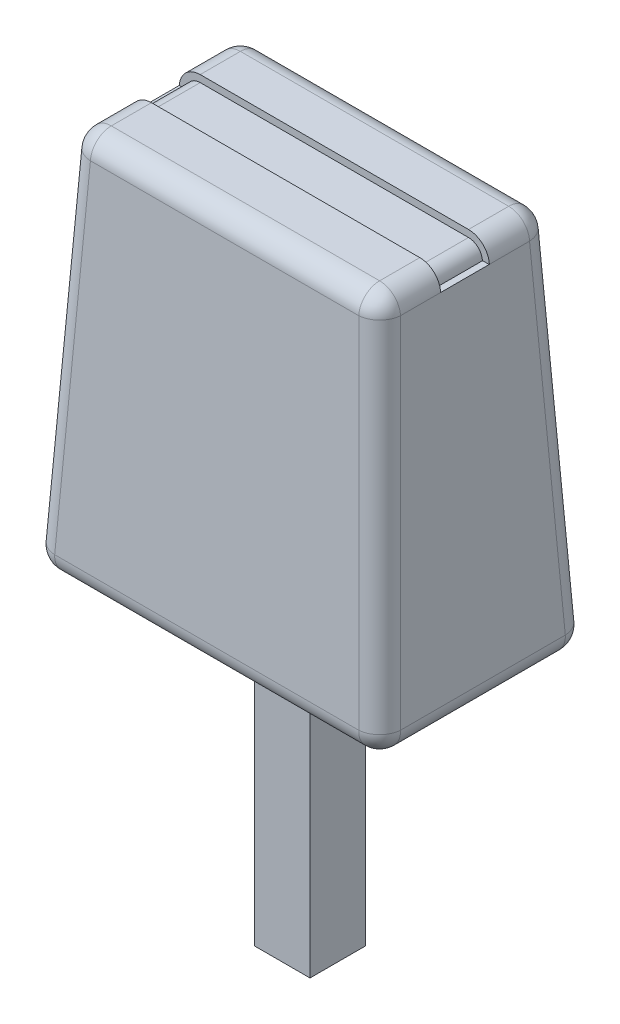
ISO-10303-21;
HEADER;
FILE_DESCRIPTION(('STEP AP214'),'2;1');
FILE_NAME('part.step','',(''),(''),'','','');
FILE_SCHEMA(('AUTOMOTIVE_DESIGN { 1 0 10303 214 1 1 1 1 }'));
ENDSEC;
DATA;
#1=APPLICATION_CONTEXT('core data for automotive mechanical design processes');
#2=APPLICATION_PROTOCOL_DEFINITION('international standard','automotive_design',2000,#1);
#3=PRODUCT_CONTEXT('',#1,'mechanical');
#4=PRODUCT('Part','Part','',(#3));
#5=PRODUCT_RELATED_PRODUCT_CATEGORY('part','',(#4));
#6=PRODUCT_DEFINITION_FORMATION('','',#4);
#7=PRODUCT_DEFINITION_CONTEXT('part definition',#1,'design');
#8=PRODUCT_DEFINITION('design','',#6,#7);
#9=PRODUCT_DEFINITION_SHAPE('','',#8);
#10=(LENGTH_UNIT() NAMED_UNIT(*) SI_UNIT(.MILLI.,.METRE.));
#11=(NAMED_UNIT(*) PLANE_ANGLE_UNIT() SI_UNIT($,.RADIAN.));
#12=(NAMED_UNIT(*) SI_UNIT($,.STERADIAN.) SOLID_ANGLE_UNIT());
#13=UNCERTAINTY_MEASURE_WITH_UNIT(LENGTH_MEASURE(1.E-05),#10,'distance_accuracy_value','');
#14=(GEOMETRIC_REPRESENTATION_CONTEXT(3) GLOBAL_UNCERTAINTY_ASSIGNED_CONTEXT((#13)) GLOBAL_UNIT_ASSIGNED_CONTEXT((#10,
#11,#12)) REPRESENTATION_CONTEXT('',''));
#15=CARTESIAN_POINT('',(0.,0.,0.));
#16=DIRECTION('',(0.,0.,1.));
#17=DIRECTION('',(1.,0.,0.));
#18=AXIS2_PLACEMENT_3D('',#15,#16,#17);
#19=CARTESIAN_POINT('',(0.,27.5,0.));
#20=DIRECTION('',(0.,-1.,0.));
#21=DIRECTION('',(0.,0.,-1.));
#22=AXIS2_PLACEMENT_3D('',#19,#20,#21);
#23=PLANE('',#22);
#24=DIRECTION('',(-1.,0.,0.));
#25=VECTOR('',#24,1.);
#26=CARTESIAN_POINT('',(-9.63533921964405,27.5,-1.75));
#27=LINE('',#26,#25);
#28=CARTESIAN_POINT('',(9.63533921964404,27.5,-1.75));
#29=VERTEX_POINT('',#28);
#30=CARTESIAN_POINT('',(-9.63533921964405,27.5,-1.75));
#31=VERTEX_POINT('',#30);
#32=EDGE_CURVE('E215',#29,#31,#27,.T.);
#33=ORIENTED_EDGE('',*,*,#32,.F.);
#34=DIRECTION('',(0.,0.,1.));
#35=VECTOR('',#34,1.);
#36=CARTESIAN_POINT('',(9.63533921964404,27.5,0.));
#37=LINE('',#36,#35);
#38=CARTESIAN_POINT('',(9.63533921964404,27.5,-4.63533921964404));
#39=VERTEX_POINT('',#38);
#40=EDGE_CURVE('E228',#29,#39,#37,.F.);
#41=ORIENTED_EDGE('',*,*,#40,.T.);
#42=DIRECTION('',(1.,0.,0.));
#43=VECTOR('',#42,1.);
#44=CARTESIAN_POINT('',(0.,27.5,-4.63533921964404));
#45=LINE('',#44,#43);
#46=CARTESIAN_POINT('',(-9.63533921964405,27.5,-4.63533921964404));
#47=VERTEX_POINT('',#46);
#48=EDGE_CURVE('E241',#39,#47,#45,.F.);
#49=ORIENTED_EDGE('',*,*,#48,.T.);
#50=DIRECTION('',(0.,0.,-1.));
#51=VECTOR('',#50,1.);
#52=CARTESIAN_POINT('',(-9.63533921964405,27.5,0.));
#53=LINE('',#52,#51);
#54=EDGE_CURVE('E56',#47,#31,#53,.F.);
#55=ORIENTED_EDGE('',*,*,#54,.T.);
#56=EDGE_LOOP('',(#33,#41,#49,#55));
#57=FACE_BOUND('',#56,.T.);
#58=ADVANCED_FACE('F47',(#57),#23,.F.);
#59=CARTESIAN_POINT('',(-9.63533921964405,26.,0.));
#60=DIRECTION('',(0.,0.,-1.));
#61=DIRECTION('',(-1.,0.,0.));
#62=AXIS2_PLACEMENT_3D('',#59,#60,#61);
#63=CYLINDRICAL_SURFACE('',#62,1.5);
#64=DIRECTION('',(0.,0.,1.));
#65=VECTOR('',#64,1.);
#66=CARTESIAN_POINT('',(-11.1332835217759,26.0785039343644,7.5));
#67=LINE('',#66,#65);
#68=CARTESIAN_POINT('',(-11.1332835217759,26.0785039343644,-1.75));
#69=VERTEX_POINT('',#68);
#70=CARTESIAN_POINT('',(-11.1332835217759,26.0785039343644,-4.63533921964404));
#71=VERTEX_POINT('',#70);
#72=EDGE_CURVE('E363',#69,#71,#67,.F.);
#73=ORIENTED_EDGE('',*,*,#72,.F.);
#74=CARTESIAN_POINT('',(-9.63533921964405,26.,-1.75));
#75=DIRECTION('',(0.,0.,1.));
#76=DIRECTION('',(1.,0.,0.));
#77=AXIS2_PLACEMENT_3D('',#74,#75,#76);
#78=CIRCLE('',#77,1.5);
#79=EDGE_CURVE('E231',#31,#69,#78,.T.);
#80=ORIENTED_EDGE('',*,*,#79,.F.);
#81=ORIENTED_EDGE('',*,*,#54,.F.);
#82=CARTESIAN_POINT('',(-9.63533921964405,26.,-4.63533921964404));
#83=DIRECTION('',(0.,0.,-1.));
#84=DIRECTION('',(-1.,0.,0.));
#85=AXIS2_PLACEMENT_3D('',#82,#83,#84);
#86=CIRCLE('',#85,1.5);
#87=EDGE_CURVE('E306',#47,#71,#86,.F.);
#88=ORIENTED_EDGE('',*,*,#87,.T.);
#89=EDGE_LOOP('',(#73,#80,#81,#88));
#90=FACE_BOUND('',#89,.T.);
#91=ADVANCED_FACE('F497',(#90),#63,.T.);
#92=CARTESIAN_POINT('',(9.63533921964404,26.,0.));
#93=DIRECTION('',(0.,0.,1.));
#94=DIRECTION('',(1.,0.,0.));
#95=AXIS2_PLACEMENT_3D('',#92,#93,#94);
#96=CYLINDRICAL_SURFACE('',#95,1.5);
#97=ORIENTED_EDGE('',*,*,#40,.F.);
#98=CARTESIAN_POINT('',(9.63533921964404,26.,-1.75));
#99=DIRECTION('',(0.,0.,1.));
#100=DIRECTION('',(1.,0.,0.));
#101=AXIS2_PLACEMENT_3D('',#98,#99,#100);
#102=CIRCLE('',#101,1.5);
#103=CARTESIAN_POINT('',(11.1332835217759,26.0785039343644,-1.75));
#104=VERTEX_POINT('',#103);
#105=EDGE_CURVE('E211',#104,#29,#102,.T.);
#106=ORIENTED_EDGE('',*,*,#105,.F.);
#107=DIRECTION('',(0.,0.,-1.));
#108=VECTOR('',#107,1.);
#109=CARTESIAN_POINT('',(11.1332835217759,26.0785039343644,7.5));
#110=LINE('',#109,#108);
#111=CARTESIAN_POINT('',(11.1332835217759,26.0785039343644,-4.63533921964404));
#112=VERTEX_POINT('',#111);
#113=EDGE_CURVE('E320',#112,#104,#110,.F.);
#114=ORIENTED_EDGE('',*,*,#113,.F.);
#115=CARTESIAN_POINT('',(9.63533921964404,26.,-4.63533921964404));
#116=DIRECTION('',(0.,0.,-1.));
#117=DIRECTION('',(-1.,0.,0.));
#118=AXIS2_PLACEMENT_3D('',#115,#116,#117);
#119=CIRCLE('',#118,1.5);
#120=EDGE_CURVE('E236',#112,#39,#119,.F.);
#121=ORIENTED_EDGE('',*,*,#120,.T.);
#122=EDGE_LOOP('',(#97,#106,#114,#121));
#123=FACE_BOUND('',#122,.T.);
#124=ADVANCED_FACE('F234',(#123),#96,.T.);
#125=CARTESIAN_POINT('',(0.,0.,0.));
#126=DIRECTION('',(0.,-1.,0.));
#127=DIRECTION('',(0.,0.,-1.));
#128=AXIS2_PLACEMENT_3D('',#125,#126,#127);
#129=PLANE('',#128);
#130=DIRECTION('',(0.,0.,1.));
#131=VECTOR('',#130,1.);
#132=CARTESIAN_POINT('',(10.9193298120786,0.,7.5));
#133=LINE('',#132,#131);
#134=CARTESIAN_POINT('',(10.9193298120786,0.,-5.91932981207856));
#135=VERTEX_POINT('',#134);
#136=CARTESIAN_POINT('',(10.9193298120786,0.,5.91932981207856));
#137=VERTEX_POINT('',#136);
#138=EDGE_CURVE('E358',#135,#137,#133,.T.);
#139=ORIENTED_EDGE('',*,*,#138,.T.);
#140=DIRECTION('',(-1.,0.,0.));
#141=VECTOR('',#140,1.);
#142=CARTESIAN_POINT('',(-12.5,0.,5.91932981207856));
#143=LINE('',#142,#141);
#144=CARTESIAN_POINT('',(-10.9193298120786,0.,5.91932981207856));
#145=VERTEX_POINT('',#144);
#146=EDGE_CURVE('E361',#137,#145,#143,.T.);
#147=ORIENTED_EDGE('',*,*,#146,.T.);
#148=DIRECTION('',(0.,0.,-1.));
#149=VECTOR('',#148,1.);
#150=CARTESIAN_POINT('',(-10.9193298120786,0.,-7.5));
#151=LINE('',#150,#149);
#152=CARTESIAN_POINT('',(-10.9193298120786,0.,-5.91932981207856));
#153=VERTEX_POINT('',#152);
#154=EDGE_CURVE('E356',#145,#153,#151,.T.);
#155=ORIENTED_EDGE('',*,*,#154,.T.);
#156=DIRECTION('',(1.,0.,0.));
#157=VECTOR('',#156,1.);
#158=CARTESIAN_POINT('',(12.5,0.,-5.91932981207856));
#159=LINE('',#158,#157);
#160=EDGE_CURVE('E354',#153,#135,#159,.T.);
#161=ORIENTED_EDGE('',*,*,#160,.T.);
#162=EDGE_LOOP('',(#139,#147,#155,#161));
#163=FACE_BOUND('',#162,.T.);
#164=DIRECTION('',(1.,0.,0.));
#165=VECTOR('',#164,1.);
#166=CARTESIAN_POINT('',(2.,0.,-2.));
#167=LINE('',#166,#165);
#168=CARTESIAN_POINT('',(-2.,0.,-2.));
#169=VERTEX_POINT('',#168);
#170=CARTESIAN_POINT('',(2.,0.,-2.));
#171=VERTEX_POINT('',#170);
#172=EDGE_CURVE('E455',#169,#171,#167,.T.);
#173=ORIENTED_EDGE('',*,*,#172,.F.);
#174=DIRECTION('',(0.,0.,-1.));
#175=VECTOR('',#174,1.);
#176=CARTESIAN_POINT('',(-2.,0.,2.));
#177=LINE('',#176,#175);
#178=CARTESIAN_POINT('',(-2.,0.,2.));
#179=VERTEX_POINT('',#178);
#180=EDGE_CURVE('E431',#179,#169,#177,.T.);
#181=ORIENTED_EDGE('',*,*,#180,.F.);
#182=DIRECTION('',(-1.,0.,0.));
#183=VECTOR('',#182,1.);
#184=CARTESIAN_POINT('',(2.,0.,2.));
#185=LINE('',#184,#183);
#186=CARTESIAN_POINT('',(2.,0.,2.));
#187=VERTEX_POINT('',#186);
#188=EDGE_CURVE('E446',#187,#179,#185,.T.);
#189=ORIENTED_EDGE('',*,*,#188,.F.);
#190=DIRECTION('',(0.,0.,1.));
#191=VECTOR('',#190,1.);
#192=CARTESIAN_POINT('',(2.,0.,2.));
#193=LINE('',#192,#191);
#194=EDGE_CURVE('E457',#171,#187,#193,.T.);
#195=ORIENTED_EDGE('',*,*,#194,.F.);
#196=EDGE_LOOP('',(#173,#181,#189,#195));
#197=FACE_BOUND('',#196,.T.);
#198=ADVANCED_FACE('F479',(#163,#197),#129,.T.);
#199=CARTESIAN_POINT('',(12.5,0.,7.5));
#200=DIRECTION('',(0.998629534754574,0.0523359562429439,0.));
#201=DIRECTION('',(-0.052335956242944,0.998629534754574,0.));
#202=AXIS2_PLACEMENT_3D('',#199,#200,#201);
#203=PLANE('',#202);
#204=DIRECTION('',(-0.052264427688714,0.997264688634237,-0.0522644276887141));
#205=VECTOR('',#204,1.);
#206=CARTESIAN_POINT('',(12.504091740319,-0.0780750563173734,6.00614743818713));
#207=LINE('',#206,#205);
#208=CARTESIAN_POINT('',(11.1332835217759,26.0785039343644,4.63533921964404));
#209=VERTEX_POINT('',#208);
#210=CARTESIAN_POINT('',(12.4172741142104,1.57850393436442,5.91932981207856));
#211=VERTEX_POINT('',#210);
#212=EDGE_CURVE('E332',#209,#211,#207,.F.);
#213=ORIENTED_EDGE('',*,*,#212,.T.);
#214=DIRECTION('',(0.,0.,-1.));
#215=VECTOR('',#214,1.);
#216=CARTESIAN_POINT('',(12.4172741142104,1.57850393436442,-7.5));
#217=LINE('',#216,#215);
#218=CARTESIAN_POINT('',(12.4172741142104,1.57850393436442,-5.91932981207856));
#219=VERTEX_POINT('',#218);
#220=EDGE_CURVE('E334',#211,#219,#217,.T.);
#221=ORIENTED_EDGE('',*,*,#220,.T.);
#222=DIRECTION('',(-0.052264427688714,0.997264688634237,0.0522644276887141));
#223=VECTOR('',#222,1.);
#224=CARTESIAN_POINT('',(12.4631181842946,0.703746966767107,-5.9651738821627));
#225=LINE('',#224,#223);
#226=EDGE_CURVE('E327',#219,#112,#225,.T.);
#227=ORIENTED_EDGE('',*,*,#226,.T.);
#228=ORIENTED_EDGE('',*,*,#113,.T.);
#229=DIRECTION('',(0.,0.,1.));
#230=VECTOR('',#229,1.);
#231=CARTESIAN_POINT('',(11.1332835217759,26.0785039343644,-1.75));
#232=LINE('',#231,#230);
#233=CARTESIAN_POINT('',(11.1332835217759,26.0785039343644,1.75));
#234=VERTEX_POINT('',#233);
#235=EDGE_CURVE('E429',#104,#234,#232,.T.);
#236=ORIENTED_EDGE('',*,*,#235,.T.);
#237=EDGE_CURVE('E315',#234,#209,#110,.F.);
#238=ORIENTED_EDGE('',*,*,#237,.T.);
#239=EDGE_LOOP('',(#213,#221,#227,#228,#236,#238));
#240=FACE_BOUND('',#239,.T.);
#241=ADVANCED_FACE('F552',(#240),#203,.T.);
#242=CARTESIAN_POINT('',(-12.5,0.,-7.5));
#243=DIRECTION('',(0.,0.0523359562429439,-0.998629534754574));
#244=DIRECTION('',(0.,0.998629534754574,0.052335956242944));
#245=AXIS2_PLACEMENT_3D('',#242,#243,#244);
#246=PLANE('',#245);
#247=DIRECTION('',(0.0522644276887141,0.997264688634237,0.052264427688714));
#248=VECTOR('',#247,1.);
#249=CARTESIAN_POINT('',(-11.0061474381871,-0.0780750563173734,-7.50409174031899));
#250=LINE('',#249,#248);
#251=CARTESIAN_POINT('',(-10.9193298120786,1.57850393436442,-7.41727411421042));
#252=VERTEX_POINT('',#251);
#253=CARTESIAN_POINT('',(-9.63533921964405,26.0785039343644,-6.1332835217759));
#254=VERTEX_POINT('',#253);
#255=EDGE_CURVE('E347',#252,#254,#250,.T.);
#256=ORIENTED_EDGE('',*,*,#255,.T.);
#257=DIRECTION('',(-1.,0.,0.));
#258=VECTOR('',#257,1.);
#259=CARTESIAN_POINT('',(-12.5,26.0785039343644,-6.13328352177591));
#260=LINE('',#259,#258);
#261=CARTESIAN_POINT('',(9.63533921964404,26.0785039343644,-6.1332835217759));
#262=VERTEX_POINT('',#261);
#263=EDGE_CURVE('E352',#254,#262,#260,.F.);
#264=ORIENTED_EDGE('',*,*,#263,.T.);
#265=DIRECTION('',(-0.0522644276887141,0.997264688634237,0.052264427688714));
#266=VECTOR('',#265,1.);
#267=CARTESIAN_POINT('',(10.9378581781464,1.22496164882343,-7.43580248027827));
#268=LINE('',#267,#266);
#269=CARTESIAN_POINT('',(10.9193298120786,1.57850393436442,-7.41727411421042));
#270=VERTEX_POINT('',#269);
#271=EDGE_CURVE('E349',#262,#270,#268,.F.);
#272=ORIENTED_EDGE('',*,*,#271,.T.);
#273=DIRECTION('',(-1.,0.,0.));
#274=VECTOR('',#273,1.);
#275=CARTESIAN_POINT('',(-12.5,1.57850393436442,-7.41727411421042));
#276=LINE('',#275,#274);
#277=EDGE_CURVE('E345',#270,#252,#276,.T.);
#278=ORIENTED_EDGE('',*,*,#277,.T.);
#279=EDGE_LOOP('',(#256,#264,#272,#278));
#280=FACE_BOUND('',#279,.T.);
#281=ADVANCED_FACE('F378',(#280),#246,.T.);
#282=CARTESIAN_POINT('',(-12.5,0.,7.5));
#283=DIRECTION('',(-0.998629534754574,0.0523359562429439,0.));
#284=DIRECTION('',(-0.052335956242944,-0.998629534754574,0.));
#285=AXIS2_PLACEMENT_3D('',#282,#283,#284);
#286=PLANE('',#285);
#287=DIRECTION('',(0.052264427688714,0.997264688634237,0.0522644276887141));
#288=VECTOR('',#287,1.);
#289=CARTESIAN_POINT('',(-12.4631181842946,0.703746966767107,-5.9651738821627));
#290=LINE('',#289,#288);
#291=CARTESIAN_POINT('',(-12.4172741142104,1.57850393436442,-5.91932981207856));
#292=VERTEX_POINT('',#291);
#293=EDGE_CURVE('E242',#71,#292,#290,.F.);
#294=ORIENTED_EDGE('',*,*,#293,.T.);
#295=DIRECTION('',(0.,0.,1.));
#296=VECTOR('',#295,1.);
#297=CARTESIAN_POINT('',(-12.4172741142104,1.57850393436442,7.5));
#298=LINE('',#297,#296);
#299=CARTESIAN_POINT('',(-12.4172741142104,1.57850393436442,5.91932981207856));
#300=VERTEX_POINT('',#299);
#301=EDGE_CURVE('E238',#292,#300,#298,.T.);
#302=ORIENTED_EDGE('',*,*,#301,.T.);
#303=DIRECTION('',(0.052264427688714,0.997264688634237,-0.0522644276887141));
#304=VECTOR('',#303,1.);
#305=CARTESIAN_POINT('',(-12.504091740319,-0.0780750563173734,6.00614743818713));
#306=LINE('',#305,#304);
#307=CARTESIAN_POINT('',(-11.1332835217759,26.0785039343644,4.63533921964404));
#308=VERTEX_POINT('',#307);
#309=EDGE_CURVE('E367',#300,#308,#306,.T.);
#310=ORIENTED_EDGE('',*,*,#309,.T.);
#311=CARTESIAN_POINT('',(-11.1332835217759,26.0785039343644,1.75));
#312=VERTEX_POINT('',#311);
#313=EDGE_CURVE('E364',#308,#312,#67,.F.);
#314=ORIENTED_EDGE('',*,*,#313,.T.);
#315=DIRECTION('',(0.,0.,1.));
#316=VECTOR('',#315,1.);
#317=CARTESIAN_POINT('',(-11.1332835217759,26.0785039343644,-1.75));
#318=LINE('',#317,#316);
#319=EDGE_CURVE('E440',#69,#312,#318,.T.);
#320=ORIENTED_EDGE('',*,*,#319,.F.);
#321=ORIENTED_EDGE('',*,*,#72,.T.);
#322=EDGE_LOOP('',(#294,#302,#310,#314,#320,#321));
#323=FACE_BOUND('',#322,.T.);
#324=ADVANCED_FACE('F371',(#323),#286,.T.);
#325=CARTESIAN_POINT('',(-12.5,0.,7.5));
#326=DIRECTION('',(0.,0.0523359562429439,0.998629534754574));
#327=DIRECTION('',(0.,-0.998629534754574,0.052335956242944));
#328=AXIS2_PLACEMENT_3D('',#325,#326,#327);
#329=PLANE('',#328);
#330=DIRECTION('',(-0.0522644276887141,0.997264688634237,-0.052264427688714));
#331=VECTOR('',#330,1.);
#332=CARTESIAN_POINT('',(10.9378581781464,1.22496164882343,7.43580248027827));
#333=LINE('',#332,#331);
#334=CARTESIAN_POINT('',(10.9193298120786,1.57850393436442,7.41727411421042));
#335=VERTEX_POINT('',#334);
#336=CARTESIAN_POINT('',(9.63533921964404,26.0785039343644,6.1332835217759));
#337=VERTEX_POINT('',#336);
#338=EDGE_CURVE('E340',#335,#337,#333,.T.);
#339=ORIENTED_EDGE('',*,*,#338,.T.);
#340=DIRECTION('',(1.,0.,0.));
#341=VECTOR('',#340,1.);
#342=CARTESIAN_POINT('',(-12.5,26.0785039343644,6.13328352177591));
#343=LINE('',#342,#341);
#344=CARTESIAN_POINT('',(-9.63533921964405,26.0785039343644,6.1332835217759));
#345=VERTEX_POINT('',#344);
#346=EDGE_CURVE('E343',#337,#345,#343,.F.);
#347=ORIENTED_EDGE('',*,*,#346,.T.);
#348=DIRECTION('',(0.0522644276887141,0.997264688634237,-0.052264427688714));
#349=VECTOR('',#348,1.);
#350=CARTESIAN_POINT('',(-11.0061474381871,-0.0780750563173734,7.50409174031899));
#351=LINE('',#350,#349);
#352=CARTESIAN_POINT('',(-10.9193298120786,1.57850393436442,7.41727411421042));
#353=VERTEX_POINT('',#352);
#354=EDGE_CURVE('E338',#345,#353,#351,.F.);
#355=ORIENTED_EDGE('',*,*,#354,.T.);
#356=DIRECTION('',(1.,0.,0.));
#357=VECTOR('',#356,1.);
#358=CARTESIAN_POINT('',(12.5,1.57850393436442,7.41727411421042));
#359=LINE('',#358,#357);
#360=EDGE_CURVE('E336',#353,#335,#359,.T.);
#361=ORIENTED_EDGE('',*,*,#360,.T.);
#362=EDGE_LOOP('',(#339,#347,#355,#361));
#363=FACE_BOUND('',#362,.T.);
#364=ADVANCED_FACE('F508',(#363),#329,.T.);
#365=CARTESIAN_POINT('',(9.63533921964404,27.5,4.63533921964404));
#366=VERTEX_POINT('',#365);
#367=CARTESIAN_POINT('',(9.63533921964404,27.5,1.75));
#368=VERTEX_POINT('',#367);
#369=EDGE_CURVE('E237',#366,#368,#37,.F.);
#370=ORIENTED_EDGE('',*,*,#369,.T.);
#371=DIRECTION('',(-1.,0.,0.));
#372=VECTOR('',#371,1.);
#373=CARTESIAN_POINT('',(-9.63533921964405,27.5,1.75));
#374=LINE('',#373,#372);
#375=CARTESIAN_POINT('',(-9.63533921964405,27.5,1.75));
#376=VERTEX_POINT('',#375);
#377=EDGE_CURVE('E64',#368,#376,#374,.T.);
#378=ORIENTED_EDGE('',*,*,#377,.T.);
#379=CARTESIAN_POINT('',(-9.63533921964405,27.5,4.63533921964404));
#380=VERTEX_POINT('',#379);
#381=EDGE_CURVE('E247',#376,#380,#53,.F.);
#382=ORIENTED_EDGE('',*,*,#381,.T.);
#383=DIRECTION('',(-1.,0.,0.));
#384=VECTOR('',#383,1.);
#385=CARTESIAN_POINT('',(0.,27.5,4.63533921964404));
#386=LINE('',#385,#384);
#387=EDGE_CURVE('E11',#380,#366,#386,.F.);
#388=ORIENTED_EDGE('',*,*,#387,.T.);
#389=EDGE_LOOP('',(#370,#378,#382,#388));
#390=FACE_BOUND('',#389,.T.);
#391=ADVANCED_FACE('F499',(#390),#23,.F.);
#392=CARTESIAN_POINT('',(-10.9651738821627,0.625243032402691,-5.9651738821627));
#393=DIRECTION('',(-0.052264427688714,-0.997264688634237,-0.052264427688714));
#394=DIRECTION('',(0.,0.0523359562429439,-0.998629534754574));
#395=AXIS2_PLACEMENT_3D('',#392,#393,#394);
#396=CYLINDRICAL_SURFACE('',#395,1.5);
#397=CARTESIAN_POINT('',(-9.63533921964405,26.,-4.63533921964404));
#398=DIRECTION('',(0.0522644276887143,0.997264688634237,0.0522644276887143));
#399=DIRECTION('',(0.,-0.0523359562429442,0.998629534754574));
#400=AXIS2_PLACEMENT_3D('',#397,#398,#399);
#401=CIRCLE('',#400,1.5);
#402=EDGE_CURVE('E51',#254,#71,#401,.T.);
#403=ORIENTED_EDGE('',*,*,#402,.F.);
#404=ORIENTED_EDGE('',*,*,#255,.F.);
#405=CARTESIAN_POINT('',(-10.9193298120786,1.5,-5.91932981207856));
#406=DIRECTION('',(-0.052264427688714,-0.997264688634237,-0.052264427688714));
#407=DIRECTION('',(0.,0.0523359562429439,-0.998629534754574));
#408=AXIS2_PLACEMENT_3D('',#405,#406,#407);
#409=CIRCLE('',#408,1.5);
#410=EDGE_CURVE('E308',#292,#252,#409,.T.);
#411=ORIENTED_EDGE('',*,*,#410,.F.);
#412=ORIENTED_EDGE('',*,*,#293,.F.);
#413=EDGE_LOOP('',(#403,#404,#411,#412));
#414=FACE_BOUND('',#413,.T.);
#415=ADVANCED_FACE('F49',(#414),#396,.T.);
#416=CARTESIAN_POINT('',(-9.63533921964405,26.,-4.63533921964404));
#417=DIRECTION('',(0.,1.,0.));
#418=DIRECTION('',(0.,0.,1.));
#419=AXIS2_PLACEMENT_3D('',#416,#417,#418);
#420=SPHERICAL_SURFACE('',#419,1.5);
#421=CARTESIAN_POINT('',(-9.63533921964405,26.,-4.63533921964404));
#422=DIRECTION('',(-1.,0.,0.));
#423=DIRECTION('',(0.,0.,1.));
#424=AXIS2_PLACEMENT_3D('',#421,#422,#423);
#425=CIRCLE('',#424,1.5);
#426=EDGE_CURVE('E303',#254,#47,#425,.F.);
#427=ORIENTED_EDGE('',*,*,#426,.F.);
#428=ORIENTED_EDGE('',*,*,#402,.T.);
#429=ORIENTED_EDGE('',*,*,#87,.F.);
#430=EDGE_LOOP('',(#427,#428,#429));
#431=FACE_BOUND('',#430,.T.);
#432=ADVANCED_FACE('F515',(#431),#420,.T.);
#433=CARTESIAN_POINT('',(-10.9193298120786,1.5,-5.91932981207856));
#434=DIRECTION('',(0.,-1.,0.));
#435=DIRECTION('',(0.,0.,-1.));
#436=AXIS2_PLACEMENT_3D('',#433,#434,#435);
#437=SPHERICAL_SURFACE('',#436,1.5);
#438=CARTESIAN_POINT('',(-10.9193298120786,1.5,-5.91932981207856));
#439=DIRECTION('',(0.,0.,-1.));
#440=DIRECTION('',(-1.,0.,0.));
#441=AXIS2_PLACEMENT_3D('',#438,#439,#440);
#442=CIRCLE('',#441,1.5);
#443=EDGE_CURVE('E297',#292,#153,#442,.F.);
#444=ORIENTED_EDGE('',*,*,#443,.F.);
#445=ORIENTED_EDGE('',*,*,#410,.T.);
#446=CARTESIAN_POINT('',(-10.9193298120786,1.5,-5.91932981207856));
#447=DIRECTION('',(-1.,0.,0.));
#448=DIRECTION('',(0.,0.,1.));
#449=AXIS2_PLACEMENT_3D('',#446,#447,#448);
#450=CIRCLE('',#449,1.5);
#451=EDGE_CURVE('E300',#153,#252,#450,.F.);
#452=ORIENTED_EDGE('',*,*,#451,.F.);
#453=EDGE_LOOP('',(#444,#445,#452));
#454=FACE_BOUND('',#453,.T.);
#455=ADVANCED_FACE('F387',(#454),#437,.T.);
#456=CARTESIAN_POINT('',(-9.63533921964405,26.,1.75));
#457=DIRECTION('',(0.,0.,1.));
#458=DIRECTION('',(1.,0.,0.));
#459=AXIS2_PLACEMENT_3D('',#456,#457,#458);
#460=CIRCLE('',#459,1.5);
#461=EDGE_CURVE('E408',#376,#312,#460,.T.);
#462=ORIENTED_EDGE('',*,*,#461,.T.);
#463=ORIENTED_EDGE('',*,*,#313,.F.);
#464=CARTESIAN_POINT('',(-9.63533921964405,26.,4.63533921964404));
#465=DIRECTION('',(0.,0.,1.));
#466=DIRECTION('',(1.,0.,0.));
#467=AXIS2_PLACEMENT_3D('',#464,#465,#466);
#468=CIRCLE('',#467,1.5);
#469=EDGE_CURVE('E291',#380,#308,#468,.T.);
#470=ORIENTED_EDGE('',*,*,#469,.F.);
#471=ORIENTED_EDGE('',*,*,#381,.F.);
#472=EDGE_LOOP('',(#462,#463,#470,#471));
#473=FACE_BOUND('',#472,.T.);
#474=ADVANCED_FACE('F405',(#473),#63,.T.);
#475=CARTESIAN_POINT('',(0.,26.,-4.63533921964404));
#476=DIRECTION('',(1.,0.,0.));
#477=DIRECTION('',(0.,0.,-1.));
#478=AXIS2_PLACEMENT_3D('',#475,#476,#477);
#479=CYLINDRICAL_SURFACE('',#478,1.5);
#480=ORIENTED_EDGE('',*,*,#426,.T.);
#481=ORIENTED_EDGE('',*,*,#48,.F.);
#482=CARTESIAN_POINT('',(9.63533921964404,26.,-4.63533921964404));
#483=DIRECTION('',(1.,0.,0.));
#484=DIRECTION('',(0.,0.,-1.));
#485=AXIS2_PLACEMENT_3D('',#482,#483,#484);
#486=CIRCLE('',#485,1.5);
#487=EDGE_CURVE('E288',#262,#39,#486,.T.);
#488=ORIENTED_EDGE('',*,*,#487,.F.);
#489=ORIENTED_EDGE('',*,*,#263,.F.);
#490=EDGE_LOOP('',(#480,#481,#488,#489));
#491=FACE_BOUND('',#490,.T.);
#492=ADVANCED_FACE('F563',(#491),#479,.T.);
#493=CARTESIAN_POINT('',(10.9378581781464,1.14645771445901,-5.93785817814641));
#494=DIRECTION('',(0.052264427688714,-0.997264688634237,-0.052264427688714));
#495=DIRECTION('',(0.,0.0523359562429439,-0.998629534754574));
#496=AXIS2_PLACEMENT_3D('',#493,#494,#495);
#497=CYLINDRICAL_SURFACE('',#496,1.5);
#498=CARTESIAN_POINT('',(10.9193298120786,1.5,-5.91932981207856));
#499=DIRECTION('',(0.0522644276887141,-0.997264688634237,-0.052264427688714));
#500=DIRECTION('',(0.998629534754574,0.052335956242944,0.));
#501=AXIS2_PLACEMENT_3D('',#498,#499,#500);
#502=CIRCLE('',#501,1.5);
#503=EDGE_CURVE('E282',#270,#219,#502,.T.);
#504=ORIENTED_EDGE('',*,*,#503,.F.);
#505=ORIENTED_EDGE('',*,*,#271,.F.);
#506=CARTESIAN_POINT('',(9.63533921964404,26.,-4.63533921964404));
#507=DIRECTION('',(-0.0522644276887143,0.997264688634237,0.0522644276887143));
#508=DIRECTION('',(0.,-0.0523359562429442,0.998629534754574));
#509=AXIS2_PLACEMENT_3D('',#506,#507,#508);
#510=CIRCLE('',#509,1.5);
#511=EDGE_CURVE('E285',#112,#262,#510,.T.);
#512=ORIENTED_EDGE('',*,*,#511,.F.);
#513=ORIENTED_EDGE('',*,*,#226,.F.);
#514=EDGE_LOOP('',(#504,#505,#512,#513));
#515=FACE_BOUND('',#514,.T.);
#516=ADVANCED_FACE('F558',(#515),#497,.T.);
#517=CARTESIAN_POINT('',(-12.5,1.5,-5.91932981207856));
#518=DIRECTION('',(-1.,0.,0.));
#519=DIRECTION('',(0.,0.,1.));
#520=AXIS2_PLACEMENT_3D('',#517,#518,#519);
#521=CYLINDRICAL_SURFACE('',#520,1.5);
#522=ORIENTED_EDGE('',*,*,#451,.T.);
#523=ORIENTED_EDGE('',*,*,#277,.F.);
#524=CARTESIAN_POINT('',(10.9193298120786,1.5,-5.91932981207856));
#525=DIRECTION('',(1.,0.,0.));
#526=DIRECTION('',(0.,0.,-1.));
#527=AXIS2_PLACEMENT_3D('',#524,#525,#526);
#528=CIRCLE('',#527,1.5);
#529=EDGE_CURVE('E280',#135,#270,#528,.T.);
#530=ORIENTED_EDGE('',*,*,#529,.F.);
#531=ORIENTED_EDGE('',*,*,#160,.F.);
#532=EDGE_LOOP('',(#522,#523,#530,#531));
#533=FACE_BOUND('',#532,.T.);
#534=ADVANCED_FACE('F384',(#533),#521,.T.);
#535=CARTESIAN_POINT('',(-10.9193298120786,1.5,7.5));
#536=DIRECTION('',(0.,0.,1.));
#537=DIRECTION('',(1.,0.,0.));
#538=AXIS2_PLACEMENT_3D('',#535,#536,#537);
#539=CYLINDRICAL_SURFACE('',#538,1.5);
#540=ORIENTED_EDGE('',*,*,#443,.T.);
#541=ORIENTED_EDGE('',*,*,#154,.F.);
#542=CARTESIAN_POINT('',(-10.9193298120786,1.5,5.91932981207856));
#543=DIRECTION('',(0.,0.,1.));
#544=DIRECTION('',(0.,-1.,0.));
#545=AXIS2_PLACEMENT_3D('',#542,#543,#544);
#546=CIRCLE('',#545,1.5);
#547=EDGE_CURVE('E277',#300,#145,#546,.T.);
#548=ORIENTED_EDGE('',*,*,#547,.F.);
#549=ORIENTED_EDGE('',*,*,#301,.F.);
#550=EDGE_LOOP('',(#540,#541,#548,#549));
#551=FACE_BOUND('',#550,.T.);
#552=ADVANCED_FACE('F390',(#551),#539,.T.);
#553=CARTESIAN_POINT('',(-11.0061474381871,-0.156578990681789,6.00614743818713));
#554=DIRECTION('',(-0.052264427688714,-0.997264688634237,0.052264427688714));
#555=DIRECTION('',(0.,-0.0523359562429439,-0.998629534754574));
#556=AXIS2_PLACEMENT_3D('',#553,#554,#555);
#557=CYLINDRICAL_SURFACE('',#556,1.5);
#558=CARTESIAN_POINT('',(-9.63533921964405,26.,4.63533921964404));
#559=DIRECTION('',(0.0522644276887143,0.997264688634237,-0.0522644276887144));
#560=DIRECTION('',(0.,0.0523359562429443,0.998629534754574));
#561=AXIS2_PLACEMENT_3D('',#558,#559,#560);
#562=CIRCLE('',#561,1.5);
#563=EDGE_CURVE('E294',#308,#345,#562,.T.);
#564=ORIENTED_EDGE('',*,*,#563,.F.);
#565=ORIENTED_EDGE('',*,*,#309,.F.);
#566=CARTESIAN_POINT('',(-10.9193298120786,1.5,5.91932981207856));
#567=DIRECTION('',(-0.052264427688714,-0.997264688634237,0.052264427688714));
#568=DIRECTION('',(0.,-0.0523359562429439,-0.998629534754574));
#569=AXIS2_PLACEMENT_3D('',#566,#567,#568);
#570=CIRCLE('',#569,1.5);
#571=EDGE_CURVE('E274',#353,#300,#570,.T.);
#572=ORIENTED_EDGE('',*,*,#571,.F.);
#573=ORIENTED_EDGE('',*,*,#354,.F.);
#574=EDGE_LOOP('',(#564,#565,#572,#573));
#575=FACE_BOUND('',#574,.T.);
#576=ADVANCED_FACE('F400',(#575),#557,.T.);
#577=CARTESIAN_POINT('',(-9.63533921964405,26.,4.63533921964404));
#578=DIRECTION('',(0.,1.,0.));
#579=DIRECTION('',(0.,0.,1.));
#580=AXIS2_PLACEMENT_3D('',#577,#578,#579);
#581=SPHERICAL_SURFACE('',#580,1.5);
#582=ORIENTED_EDGE('',*,*,#469,.T.);
#583=ORIENTED_EDGE('',*,*,#563,.T.);
#584=CARTESIAN_POINT('',(-9.63533921964405,26.,4.63533921964404));
#585=DIRECTION('',(-1.,0.,0.));
#586=DIRECTION('',(0.,-1.,0.));
#587=AXIS2_PLACEMENT_3D('',#584,#585,#586);
#588=CIRCLE('',#587,1.5);
#589=EDGE_CURVE('E271',#380,#345,#588,.F.);
#590=ORIENTED_EDGE('',*,*,#589,.F.);
#591=EDGE_LOOP('',(#582,#583,#590));
#592=FACE_BOUND('',#591,.T.);
#593=ADVANCED_FACE('F580',(#592),#581,.T.);
#594=CARTESIAN_POINT('',(9.63533921964404,26.,-4.63533921964404));
#595=DIRECTION('',(0.,1.,0.));
#596=DIRECTION('',(0.,0.,1.));
#597=AXIS2_PLACEMENT_3D('',#594,#595,#596);
#598=SPHERICAL_SURFACE('',#597,1.5);
#599=ORIENTED_EDGE('',*,*,#511,.T.);
#600=ORIENTED_EDGE('',*,*,#487,.T.);
#601=ORIENTED_EDGE('',*,*,#120,.F.);
#602=EDGE_LOOP('',(#599,#600,#601));
#603=FACE_BOUND('',#602,.T.);
#604=ADVANCED_FACE('F561',(#603),#598,.T.);
#605=CARTESIAN_POINT('',(10.9193298120786,1.5,-5.91932981207856));
#606=DIRECTION('',(0.,-1.,0.));
#607=DIRECTION('',(0.,0.,-1.));
#608=AXIS2_PLACEMENT_3D('',#605,#606,#607);
#609=SPHERICAL_SURFACE('',#608,1.5);
#610=ORIENTED_EDGE('',*,*,#529,.T.);
#611=ORIENTED_EDGE('',*,*,#503,.T.);
#612=CARTESIAN_POINT('',(10.9193298120786,1.5,-5.91932981207856));
#613=DIRECTION('',(0.,0.,-1.));
#614=DIRECTION('',(-1.,0.,0.));
#615=AXIS2_PLACEMENT_3D('',#612,#613,#614);
#616=CIRCLE('',#615,1.5);
#617=EDGE_CURVE('E267',#135,#219,#616,.F.);
#618=ORIENTED_EDGE('',*,*,#617,.F.);
#619=EDGE_LOOP('',(#610,#611,#618));
#620=FACE_BOUND('',#619,.T.);
#621=ADVANCED_FACE('F586',(#620),#609,.T.);
#622=CARTESIAN_POINT('',(-10.9193298120786,1.5,5.91932981207856));
#623=DIRECTION('',(0.,-1.,0.));
#624=DIRECTION('',(0.,0.,-1.));
#625=AXIS2_PLACEMENT_3D('',#622,#623,#624);
#626=SPHERICAL_SURFACE('',#625,1.5);
#627=ORIENTED_EDGE('',*,*,#571,.T.);
#628=ORIENTED_EDGE('',*,*,#547,.T.);
#629=CARTESIAN_POINT('',(-10.9193298120786,1.5,5.91932981207856));
#630=DIRECTION('',(-1.,0.,0.));
#631=DIRECTION('',(0.,0.,1.));
#632=AXIS2_PLACEMENT_3D('',#629,#630,#631);
#633=CIRCLE('',#632,1.5);
#634=EDGE_CURVE('E264',#353,#145,#633,.F.);
#635=ORIENTED_EDGE('',*,*,#634,.F.);
#636=EDGE_LOOP('',(#627,#628,#635));
#637=FACE_BOUND('',#636,.T.);
#638=ADVANCED_FACE('F395',(#637),#626,.T.);
#639=CARTESIAN_POINT('',(0.,26.,4.63533921964404));
#640=DIRECTION('',(-1.,0.,0.));
#641=DIRECTION('',(0.,0.,1.));
#642=AXIS2_PLACEMENT_3D('',#639,#640,#641);
#643=CYLINDRICAL_SURFACE('',#642,1.5);
#644=ORIENTED_EDGE('',*,*,#589,.T.);
#645=ORIENTED_EDGE('',*,*,#346,.F.);
#646=CARTESIAN_POINT('',(9.63533921964404,26.,4.63533921964404));
#647=DIRECTION('',(1.,0.,0.));
#648=DIRECTION('',(0.,0.,-1.));
#649=AXIS2_PLACEMENT_3D('',#646,#647,#648);
#650=CIRCLE('',#649,1.5);
#651=EDGE_CURVE('E261',#366,#337,#650,.T.);
#652=ORIENTED_EDGE('',*,*,#651,.F.);
#653=ORIENTED_EDGE('',*,*,#387,.F.);
#654=EDGE_LOOP('',(#644,#645,#652,#653));
#655=FACE_BOUND('',#654,.T.);
#656=ADVANCED_FACE('F592',(#655),#643,.T.);
#657=CARTESIAN_POINT('',(9.63533921964404,26.,1.75));
#658=DIRECTION('',(0.,0.,1.));
#659=DIRECTION('',(1.,0.,0.));
#660=AXIS2_PLACEMENT_3D('',#657,#658,#659);
#661=CIRCLE('',#660,1.5);
#662=EDGE_CURVE('E415',#234,#368,#661,.T.);
#663=ORIENTED_EDGE('',*,*,#662,.T.);
#664=ORIENTED_EDGE('',*,*,#369,.F.);
#665=CARTESIAN_POINT('',(9.63533921964404,26.,4.63533921964404));
#666=DIRECTION('',(0.,0.,1.));
#667=DIRECTION('',(1.,0.,0.));
#668=AXIS2_PLACEMENT_3D('',#665,#666,#667);
#669=CIRCLE('',#668,1.5);
#670=EDGE_CURVE('E259',#209,#366,#669,.T.);
#671=ORIENTED_EDGE('',*,*,#670,.F.);
#672=ORIENTED_EDGE('',*,*,#237,.F.);
#673=EDGE_LOOP('',(#663,#664,#671,#672));
#674=FACE_BOUND('',#673,.T.);
#675=ADVANCED_FACE('F522',(#674),#96,.T.);
#676=CARTESIAN_POINT('',(10.9193298120786,1.5,7.5));
#677=DIRECTION('',(0.,0.,-1.));
#678=DIRECTION('',(-1.,0.,0.));
#679=AXIS2_PLACEMENT_3D('',#676,#677,#678);
#680=CYLINDRICAL_SURFACE('',#679,1.5);
#681=ORIENTED_EDGE('',*,*,#617,.T.);
#682=ORIENTED_EDGE('',*,*,#220,.F.);
#683=CARTESIAN_POINT('',(10.9193298120786,1.5,5.91932981207856));
#684=DIRECTION('',(0.,0.,1.));
#685=DIRECTION('',(1.,0.,0.));
#686=AXIS2_PLACEMENT_3D('',#683,#684,#685);
#687=CIRCLE('',#686,1.5);
#688=EDGE_CURVE('E256',#137,#211,#687,.T.);
#689=ORIENTED_EDGE('',*,*,#688,.F.);
#690=ORIENTED_EDGE('',*,*,#138,.F.);
#691=EDGE_LOOP('',(#681,#682,#689,#690));
#692=FACE_BOUND('',#691,.T.);
#693=ADVANCED_FACE('F598',(#692),#680,.T.);
#694=CARTESIAN_POINT('',(-12.5,1.5,5.91932981207856));
#695=DIRECTION('',(1.,0.,0.));
#696=DIRECTION('',(0.,0.,-1.));
#697=AXIS2_PLACEMENT_3D('',#694,#695,#696);
#698=CYLINDRICAL_SURFACE('',#697,1.5);
#699=ORIENTED_EDGE('',*,*,#634,.T.);
#700=ORIENTED_EDGE('',*,*,#146,.F.);
#701=CARTESIAN_POINT('',(10.9193298120786,1.5,5.91932981207856));
#702=DIRECTION('',(1.,0.,0.));
#703=DIRECTION('',(0.,1.,0.));
#704=AXIS2_PLACEMENT_3D('',#701,#702,#703);
#705=CIRCLE('',#704,1.5);
#706=EDGE_CURVE('E254',#335,#137,#705,.T.);
#707=ORIENTED_EDGE('',*,*,#706,.F.);
#708=ORIENTED_EDGE('',*,*,#360,.F.);
#709=EDGE_LOOP('',(#699,#700,#707,#708));
#710=FACE_BOUND('',#709,.T.);
#711=ADVANCED_FACE('F601',(#710),#698,.T.);
#712=CARTESIAN_POINT('',(9.63533921964404,26.,4.63533921964404));
#713=DIRECTION('',(0.,1.,0.));
#714=DIRECTION('',(0.,0.,1.));
#715=AXIS2_PLACEMENT_3D('',#712,#713,#714);
#716=SPHERICAL_SURFACE('',#715,1.5);
#717=ORIENTED_EDGE('',*,*,#670,.T.);
#718=ORIENTED_EDGE('',*,*,#651,.T.);
#719=CARTESIAN_POINT('',(9.63533921964404,26.,4.63533921964404));
#720=DIRECTION('',(-0.0522644276887142,0.997264688634237,-0.0522644276887143));
#721=DIRECTION('',(0.,0.0523359562429442,0.998629534754574));
#722=AXIS2_PLACEMENT_3D('',#719,#720,#721);
#723=CIRCLE('',#722,1.5);
#724=EDGE_CURVE('E251',#209,#337,#723,.F.);
#725=ORIENTED_EDGE('',*,*,#724,.F.);
#726=EDGE_LOOP('',(#717,#718,#725));
#727=FACE_BOUND('',#726,.T.);
#728=ADVANCED_FACE('F605',(#727),#716,.T.);
#729=CARTESIAN_POINT('',(10.9193298120786,1.5,5.91932981207856));
#730=DIRECTION('',(0.,-1.,0.));
#731=DIRECTION('',(0.,0.,-1.));
#732=AXIS2_PLACEMENT_3D('',#729,#730,#731);
#733=SPHERICAL_SURFACE('',#732,1.5);
#734=ORIENTED_EDGE('',*,*,#706,.T.);
#735=ORIENTED_EDGE('',*,*,#688,.T.);
#736=CARTESIAN_POINT('',(10.9193298120786,1.5,5.91932981207856));
#737=DIRECTION('',(0.052264427688714,-0.997264688634237,0.0522644276887141));
#738=DIRECTION('',(0.,-0.052335956242944,-0.998629534754574));
#739=AXIS2_PLACEMENT_3D('',#736,#737,#738);
#740=CIRCLE('',#739,1.5);
#741=EDGE_CURVE('E249',#335,#211,#740,.F.);
#742=ORIENTED_EDGE('',*,*,#741,.F.);
#743=EDGE_LOOP('',(#734,#735,#742));
#744=FACE_BOUND('',#743,.T.);
#745=ADVANCED_FACE('F609',(#744),#733,.T.);
#746=CARTESIAN_POINT('',(11.0061474381871,-0.156578990681789,6.00614743818713));
#747=DIRECTION('',(0.052264427688714,-0.997264688634237,0.052264427688714));
#748=DIRECTION('',(0.,-0.0523359562429439,-0.998629534754574));
#749=AXIS2_PLACEMENT_3D('',#746,#747,#748);
#750=CYLINDRICAL_SURFACE('',#749,1.5);
#751=ORIENTED_EDGE('',*,*,#724,.T.);
#752=ORIENTED_EDGE('',*,*,#338,.F.);
#753=ORIENTED_EDGE('',*,*,#741,.T.);
#754=ORIENTED_EDGE('',*,*,#212,.F.);
#755=EDGE_LOOP('',(#751,#752,#753,#754));
#756=FACE_BOUND('',#755,.T.);
#757=ADVANCED_FACE('F613',(#756),#750,.T.);
#758=CARTESIAN_POINT('',(-2.,-21.,2.));
#759=DIRECTION('',(1.,0.,0.));
#760=DIRECTION('',(0.,0.,-1.));
#761=AXIS2_PLACEMENT_3D('',#758,#759,#760);
#762=PLANE('',#761);
#763=ORIENTED_EDGE('',*,*,#180,.T.);
#764=DIRECTION('',(0.,1.,0.));
#765=VECTOR('',#764,1.);
#766=CARTESIAN_POINT('',(-2.,-21.,-2.));
#767=LINE('',#766,#765);
#768=CARTESIAN_POINT('',(-2.,-21.,-2.));
#769=VERTEX_POINT('',#768);
#770=EDGE_CURVE('E252',#769,#169,#767,.T.);
#771=ORIENTED_EDGE('',*,*,#770,.F.);
#772=DIRECTION('',(0.,0.,-1.));
#773=VECTOR('',#772,1.);
#774=CARTESIAN_POINT('',(-2.,-21.,2.));
#775=LINE('',#774,#773);
#776=CARTESIAN_POINT('',(-2.,-21.,2.));
#777=VERTEX_POINT('',#776);
#778=EDGE_CURVE('E442',#777,#769,#775,.T.);
#779=ORIENTED_EDGE('',*,*,#778,.F.);
#780=DIRECTION('',(0.,1.,0.));
#781=VECTOR('',#780,1.);
#782=CARTESIAN_POINT('',(-2.,-21.,2.));
#783=LINE('',#782,#781);
#784=EDGE_CURVE('E452',#777,#179,#783,.T.);
#785=ORIENTED_EDGE('',*,*,#784,.T.);
#786=EDGE_LOOP('',(#763,#771,#779,#785));
#787=FACE_BOUND('',#786,.T.);
#788=ADVANCED_FACE('F475',(#787),#762,.F.);
#789=CARTESIAN_POINT('',(2.,-21.,-2.));
#790=DIRECTION('',(0.,0.,1.));
#791=DIRECTION('',(0.,-1.,0.));
#792=AXIS2_PLACEMENT_3D('',#789,#790,#791);
#793=PLANE('',#792);
#794=ORIENTED_EDGE('',*,*,#172,.T.);
#795=DIRECTION('',(0.,1.,0.));
#796=VECTOR('',#795,1.);
#797=CARTESIAN_POINT('',(2.,-21.,-2.));
#798=LINE('',#797,#796);
#799=CARTESIAN_POINT('',(2.,-21.,-2.));
#800=VERTEX_POINT('',#799);
#801=EDGE_CURVE('E462',#800,#171,#798,.T.);
#802=ORIENTED_EDGE('',*,*,#801,.F.);
#803=DIRECTION('',(1.,0.,0.));
#804=VECTOR('',#803,1.);
#805=CARTESIAN_POINT('',(2.,-21.,-2.));
#806=LINE('',#805,#804);
#807=EDGE_CURVE('E445',#769,#800,#806,.T.);
#808=ORIENTED_EDGE('',*,*,#807,.F.);
#809=ORIENTED_EDGE('',*,*,#770,.T.);
#810=EDGE_LOOP('',(#794,#802,#808,#809));
#811=FACE_BOUND('',#810,.T.);
#812=ADVANCED_FACE('F470',(#811),#793,.F.);
#813=CARTESIAN_POINT('',(2.,-21.,2.));
#814=DIRECTION('',(-1.,0.,0.));
#815=DIRECTION('',(0.,0.,1.));
#816=AXIS2_PLACEMENT_3D('',#813,#814,#815);
#817=PLANE('',#816);
#818=ORIENTED_EDGE('',*,*,#194,.T.);
#819=DIRECTION('',(0.,1.,0.));
#820=VECTOR('',#819,1.);
#821=CARTESIAN_POINT('',(2.,-21.,2.));
#822=LINE('',#821,#820);
#823=CARTESIAN_POINT('',(2.,-21.,2.));
#824=VERTEX_POINT('',#823);
#825=EDGE_CURVE('E72',#824,#187,#822,.T.);
#826=ORIENTED_EDGE('',*,*,#825,.F.);
#827=DIRECTION('',(0.,0.,1.));
#828=VECTOR('',#827,1.);
#829=CARTESIAN_POINT('',(2.,-21.,2.));
#830=LINE('',#829,#828);
#831=EDGE_CURVE('E448',#800,#824,#830,.T.);
#832=ORIENTED_EDGE('',*,*,#831,.F.);
#833=ORIENTED_EDGE('',*,*,#801,.T.);
#834=EDGE_LOOP('',(#818,#826,#832,#833));
#835=FACE_BOUND('',#834,.T.);
#836=ADVANCED_FACE('F480',(#835),#817,.F.);
#837=CARTESIAN_POINT('',(2.,-21.,2.));
#838=DIRECTION('',(0.,0.,-1.));
#839=DIRECTION('',(0.,1.,0.));
#840=AXIS2_PLACEMENT_3D('',#837,#838,#839);
#841=PLANE('',#840);
#842=ORIENTED_EDGE('',*,*,#188,.T.);
#843=ORIENTED_EDGE('',*,*,#784,.F.);
#844=DIRECTION('',(-1.,0.,0.));
#845=VECTOR('',#844,1.);
#846=CARTESIAN_POINT('',(2.,-21.,2.));
#847=LINE('',#846,#845);
#848=EDGE_CURVE('E450',#824,#777,#847,.T.);
#849=ORIENTED_EDGE('',*,*,#848,.F.);
#850=ORIENTED_EDGE('',*,*,#825,.T.);
#851=EDGE_LOOP('',(#842,#843,#849,#850));
#852=FACE_BOUND('',#851,.T.);
#853=ADVANCED_FACE('F481',(#852),#841,.F.);
#854=CARTESIAN_POINT('',(0.,-21.,0.));
#855=DIRECTION('',(0.,1.,0.));
#856=DIRECTION('',(0.,0.,1.));
#857=AXIS2_PLACEMENT_3D('',#854,#855,#856);
#858=PLANE('',#857);
#859=ORIENTED_EDGE('',*,*,#778,.T.);
#860=ORIENTED_EDGE('',*,*,#807,.T.);
#861=ORIENTED_EDGE('',*,*,#831,.T.);
#862=ORIENTED_EDGE('',*,*,#848,.T.);
#863=EDGE_LOOP('',(#859,#860,#861,#862));
#864=FACE_BOUND('',#863,.T.);
#865=ADVANCED_FACE('F483',(#864),#858,.F.);
#866=CARTESIAN_POINT('',(10.6339687543986,26.0523359562429,-1.75));
#867=DIRECTION('',(0.0523359562429466,-0.998629534754574,0.));
#868=DIRECTION('',(0.998629534754574,0.0523359562429466,0.));
#869=AXIS2_PLACEMENT_3D('',#866,#867,#868);
#870=PLANE('',#869);
#871=DIRECTION('',(0.998629534754574,0.0523359562429466,0.));
#872=VECTOR('',#871,1.);
#873=CARTESIAN_POINT('',(10.6339687543986,26.0523359562429,1.75));
#874=LINE('',#873,#872);
#875=CARTESIAN_POINT('',(10.6339687543986,26.0523359562429,1.75));
#876=VERTEX_POINT('',#875);
#877=EDGE_CURVE('E224',#876,#234,#874,.T.);
#878=ORIENTED_EDGE('',*,*,#877,.T.);
#879=ORIENTED_EDGE('',*,*,#235,.F.);
#880=DIRECTION('',(0.998629534754574,0.0523359562429466,0.));
#881=VECTOR('',#880,1.);
#882=CARTESIAN_POINT('',(10.6339687543986,26.0523359562429,-1.75));
#883=LINE('',#882,#881);
#884=CARTESIAN_POINT('',(10.6339687543986,26.0523359562429,-1.75));
#885=VERTEX_POINT('',#884);
#886=EDGE_CURVE('E219',#885,#104,#883,.T.);
#887=ORIENTED_EDGE('',*,*,#886,.F.);
#888=DIRECTION('',(0.,0.,1.));
#889=VECTOR('',#888,1.);
#890=CARTESIAN_POINT('',(10.6339687543986,26.0523359562429,-1.75));
#891=LINE('',#890,#889);
#892=EDGE_CURVE('E432',#885,#876,#891,.T.);
#893=ORIENTED_EDGE('',*,*,#892,.T.);
#894=EDGE_LOOP('',(#878,#879,#887,#893));
#895=FACE_BOUND('',#894,.T.);
#896=ADVANCED_FACE('F485',(#895),#870,.F.);
#897=CARTESIAN_POINT('',(9.63533921964404,26.,-1.75));
#898=DIRECTION('',(0.,0.,1.));
#899=DIRECTION('',(1.,0.,0.));
#900=AXIS2_PLACEMENT_3D('',#897,#898,#899);
#901=CYLINDRICAL_SURFACE('',#900,1.);
#902=CARTESIAN_POINT('',(9.63533921964404,26.,1.75));
#903=DIRECTION('',(0.,0.,-1.));
#904=DIRECTION('',(1.,0.,0.));
#905=AXIS2_PLACEMENT_3D('',#902,#903,#904);
#906=CIRCLE('',#905,1.);
#907=CARTESIAN_POINT('',(9.63533921964404,27.,1.75));
#908=VERTEX_POINT('',#907);
#909=EDGE_CURVE('E424',#908,#876,#906,.T.);
#910=ORIENTED_EDGE('',*,*,#909,.T.);
#911=ORIENTED_EDGE('',*,*,#892,.F.);
#912=CARTESIAN_POINT('',(9.63533921964404,26.,-1.75));
#913=DIRECTION('',(0.,0.,-1.));
#914=DIRECTION('',(1.,0.,0.));
#915=AXIS2_PLACEMENT_3D('',#912,#913,#914);
#916=CIRCLE('',#915,1.);
#917=CARTESIAN_POINT('',(9.63533921964404,27.,-1.75));
#918=VERTEX_POINT('',#917);
#919=EDGE_CURVE('E527',#918,#885,#916,.T.);
#920=ORIENTED_EDGE('',*,*,#919,.F.);
#921=DIRECTION('',(0.,0.,1.));
#922=VECTOR('',#921,1.);
#923=CARTESIAN_POINT('',(9.63533921964404,27.,-1.75));
#924=LINE('',#923,#922);
#925=EDGE_CURVE('E434',#918,#908,#924,.T.);
#926=ORIENTED_EDGE('',*,*,#925,.T.);
#927=EDGE_LOOP('',(#910,#911,#920,#926));
#928=FACE_BOUND('',#927,.T.);
#929=ADVANCED_FACE('F492',(#928),#901,.T.);
#930=CARTESIAN_POINT('',(-9.63533921964405,27.,-1.75));
#931=DIRECTION('',(0.,-1.,0.));
#932=DIRECTION('',(0.,0.,-1.));
#933=AXIS2_PLACEMENT_3D('',#930,#931,#932);
#934=PLANE('',#933);
#935=DIRECTION('',(1.,0.,0.));
#936=VECTOR('',#935,1.);
#937=CARTESIAN_POINT('',(-9.63533921964405,27.,1.75));
#938=LINE('',#937,#936);
#939=CARTESIAN_POINT('',(-9.63533921964405,27.,1.75));
#940=VERTEX_POINT('',#939);
#941=EDGE_CURVE('E421',#940,#908,#938,.T.);
#942=ORIENTED_EDGE('',*,*,#941,.T.);
#943=ORIENTED_EDGE('',*,*,#925,.F.);
#944=DIRECTION('',(1.,0.,0.));
#945=VECTOR('',#944,1.);
#946=CARTESIAN_POINT('',(-9.63533921964405,27.,-1.75));
#947=LINE('',#946,#945);
#948=CARTESIAN_POINT('',(-9.63533921964405,27.,-1.75));
#949=VERTEX_POINT('',#948);
#950=EDGE_CURVE('E529',#949,#918,#947,.T.);
#951=ORIENTED_EDGE('',*,*,#950,.F.);
#952=DIRECTION('',(0.,0.,1.));
#953=VECTOR('',#952,1.);
#954=CARTESIAN_POINT('',(-9.63533921964405,27.,-1.75));
#955=LINE('',#954,#953);
#956=EDGE_CURVE('E436',#949,#940,#955,.T.);
#957=ORIENTED_EDGE('',*,*,#956,.T.);
#958=EDGE_LOOP('',(#942,#943,#951,#957));
#959=FACE_BOUND('',#958,.T.);
#960=ADVANCED_FACE('F550',(#959),#934,.F.);
#961=CARTESIAN_POINT('',(-9.63533921964405,26.,-1.75));
#962=DIRECTION('',(0.,0.,1.));
#963=DIRECTION('',(1.,0.,0.));
#964=AXIS2_PLACEMENT_3D('',#961,#962,#963);
#965=CYLINDRICAL_SURFACE('',#964,1.);
#966=CARTESIAN_POINT('',(-9.63533921964405,26.,1.75));
#967=DIRECTION('',(0.,0.,-1.));
#968=DIRECTION('',(1.,0.,0.));
#969=AXIS2_PLACEMENT_3D('',#966,#967,#968);
#970=CIRCLE('',#969,1.);
#971=CARTESIAN_POINT('',(-10.6339687543986,26.0523359562429,1.75));
#972=VERTEX_POINT('',#971);
#973=EDGE_CURVE('E413',#972,#940,#970,.T.);
#974=ORIENTED_EDGE('',*,*,#973,.T.);
#975=ORIENTED_EDGE('',*,*,#956,.F.);
#976=CARTESIAN_POINT('',(-9.63533921964405,26.,-1.75));
#977=DIRECTION('',(0.,0.,-1.));
#978=DIRECTION('',(1.,0.,0.));
#979=AXIS2_PLACEMENT_3D('',#976,#977,#978);
#980=CIRCLE('',#979,1.);
#981=CARTESIAN_POINT('',(-10.6339687543986,26.0523359562429,-1.75));
#982=VERTEX_POINT('',#981);
#983=EDGE_CURVE('E532',#982,#949,#980,.T.);
#984=ORIENTED_EDGE('',*,*,#983,.F.);
#985=DIRECTION('',(0.,0.,1.));
#986=VECTOR('',#985,1.);
#987=CARTESIAN_POINT('',(-10.6339687543986,26.0523359562429,-1.75));
#988=LINE('',#987,#986);
#989=EDGE_CURVE('E438',#982,#972,#988,.T.);
#990=ORIENTED_EDGE('',*,*,#989,.T.);
#991=EDGE_LOOP('',(#974,#975,#984,#990));
#992=FACE_BOUND('',#991,.T.);
#993=ADVANCED_FACE('F545',(#992),#965,.T.);
#994=CARTESIAN_POINT('',(-11.1332835217759,26.0785039343644,-1.75));
#995=DIRECTION('',(-0.0523359562429466,-0.998629534754574,0.));
#996=DIRECTION('',(0.998629534754574,-0.0523359562429466,0.));
#997=AXIS2_PLACEMENT_3D('',#994,#995,#996);
#998=PLANE('',#997);
#999=DIRECTION('',(0.998629534754574,-0.0523359562429466,0.));
#1000=VECTOR('',#999,1.);
#1001=CARTESIAN_POINT('',(-11.1332835217759,26.0785039343644,1.75));
#1002=LINE('',#1001,#1000);
#1003=EDGE_CURVE('E410',#312,#972,#1002,.T.);
#1004=ORIENTED_EDGE('',*,*,#1003,.T.);
#1005=ORIENTED_EDGE('',*,*,#989,.F.);
#1006=DIRECTION('',(0.998629534754574,-0.0523359562429466,0.));
#1007=VECTOR('',#1006,1.);
#1008=CARTESIAN_POINT('',(-11.1332835217759,26.0785039343644,-1.75));
#1009=LINE('',#1008,#1007);
#1010=EDGE_CURVE('E535',#69,#982,#1009,.T.);
#1011=ORIENTED_EDGE('',*,*,#1010,.F.);
#1012=ORIENTED_EDGE('',*,*,#319,.T.);
#1013=EDGE_LOOP('',(#1004,#1005,#1011,#1012));
#1014=FACE_BOUND('',#1013,.T.);
#1015=ADVANCED_FACE('F539',(#1014),#998,.F.);
#1016=CARTESIAN_POINT('',(9.63533921964404,26.,-1.75));
#1017=DIRECTION('',(0.,0.,1.));
#1018=DIRECTION('',(1.,0.,0.));
#1019=AXIS2_PLACEMENT_3D('',#1016,#1017,#1018);
#1020=PLANE('',#1019);
#1021=ORIENTED_EDGE('',*,*,#105,.T.);
#1022=ORIENTED_EDGE('',*,*,#32,.T.);
#1023=ORIENTED_EDGE('',*,*,#79,.T.);
#1024=ORIENTED_EDGE('',*,*,#1010,.T.);
#1025=ORIENTED_EDGE('',*,*,#983,.T.);
#1026=ORIENTED_EDGE('',*,*,#950,.T.);
#1027=ORIENTED_EDGE('',*,*,#919,.T.);
#1028=ORIENTED_EDGE('',*,*,#886,.T.);
#1029=EDGE_LOOP('',(#1021,#1022,#1023,#1024,#1025,#1026,#1027,#1028));
#1030=FACE_BOUND('',#1029,.T.);
#1031=ADVANCED_FACE('F213',(#1030),#1020,.T.);
#1032=CARTESIAN_POINT('',(9.63533921964404,26.,1.75));
#1033=DIRECTION('',(0.,0.,1.));
#1034=DIRECTION('',(1.,0.,0.));
#1035=AXIS2_PLACEMENT_3D('',#1032,#1033,#1034);
#1036=PLANE('',#1035);
#1037=ORIENTED_EDGE('',*,*,#662,.F.);
#1038=ORIENTED_EDGE('',*,*,#877,.F.);
#1039=ORIENTED_EDGE('',*,*,#909,.F.);
#1040=ORIENTED_EDGE('',*,*,#941,.F.);
#1041=ORIENTED_EDGE('',*,*,#973,.F.);
#1042=ORIENTED_EDGE('',*,*,#1003,.F.);
#1043=ORIENTED_EDGE('',*,*,#461,.F.);
#1044=ORIENTED_EDGE('',*,*,#377,.F.);
#1045=EDGE_LOOP('',(#1037,#1038,#1039,#1040,#1041,#1042,#1043,#1044));
#1046=FACE_BOUND('',#1045,.T.);
#1047=ADVANCED_FACE('F541',(#1046),#1036,.F.);
#1048=CLOSED_SHELL('',(#58,#91,#124,#198,#241,#281,#324,#364,#391,#415,#432,#455,#474,#492,#516,
#534,#552,#576,#593,#604,#621,#638,#656,#675,#693,#711,#728,#745,#757,#788,#812,#836,#853,#865,
#896,#929,#960,#993,#1015,#1031,#1047));
#1049=MANIFOLD_SOLID_BREP('B2',#1048);
#1050=ADVANCED_BREP_SHAPE_REPRESENTATION('',(#18,#1049),#14);
#1051=SHAPE_DEFINITION_REPRESENTATION(#9,#1050);
ENDSEC;
END-ISO-10303-21;
